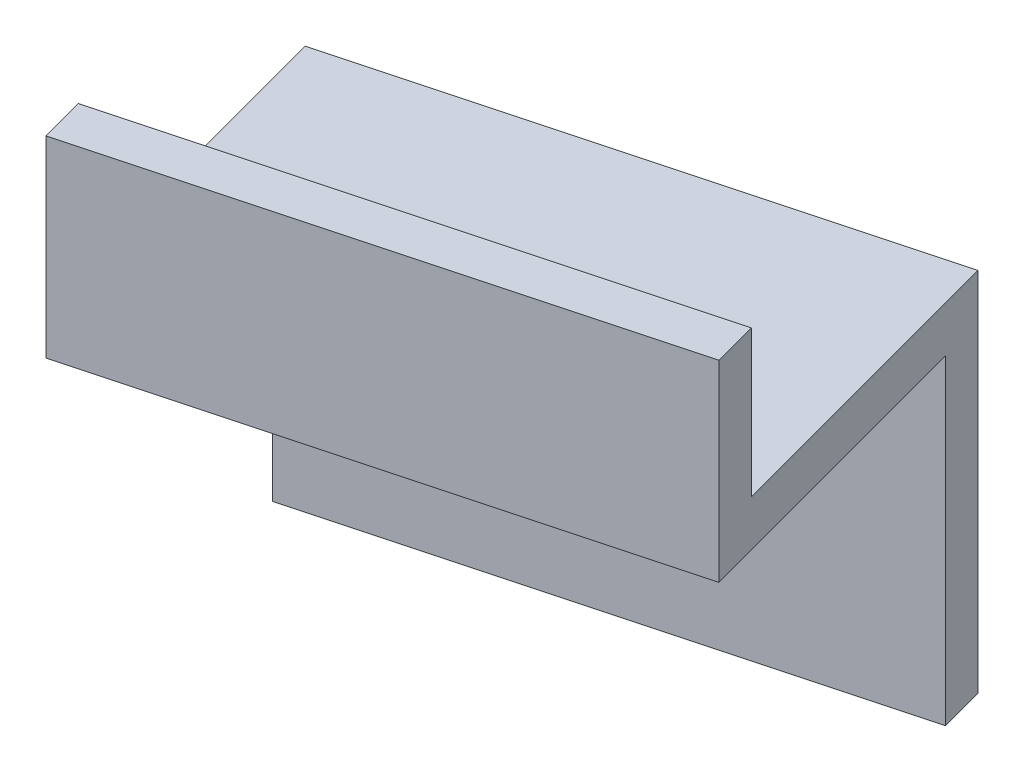
ISO-10303-21;
HEADER;
FILE_DESCRIPTION(('STEP AP214'),'2;1');
FILE_NAME('part.step','',(''),(''),'','','');
FILE_SCHEMA(('AUTOMOTIVE_DESIGN { 1 0 10303 214 1 1 1 1 }'));
ENDSEC;
DATA;
#1=APPLICATION_CONTEXT('core data for automotive mechanical design processes');
#2=APPLICATION_PROTOCOL_DEFINITION('international standard','automotive_design',2000,#1);
#3=PRODUCT_CONTEXT('',#1,'mechanical');
#4=PRODUCT('Part','Part','',(#3));
#5=PRODUCT_RELATED_PRODUCT_CATEGORY('part','',(#4));
#6=PRODUCT_DEFINITION_FORMATION('','',#4);
#7=PRODUCT_DEFINITION_CONTEXT('part definition',#1,'design');
#8=PRODUCT_DEFINITION('design','',#6,#7);
#9=PRODUCT_DEFINITION_SHAPE('','',#8);
#10=(LENGTH_UNIT() NAMED_UNIT(*) SI_UNIT(.MILLI.,.METRE.));
#11=(NAMED_UNIT(*) PLANE_ANGLE_UNIT() SI_UNIT($,.RADIAN.));
#12=(NAMED_UNIT(*) SI_UNIT($,.STERADIAN.) SOLID_ANGLE_UNIT());
#13=UNCERTAINTY_MEASURE_WITH_UNIT(LENGTH_MEASURE(1.E-05),#10,'distance_accuracy_value','');
#14=(GEOMETRIC_REPRESENTATION_CONTEXT(3) GLOBAL_UNCERTAINTY_ASSIGNED_CONTEXT((#13)) GLOBAL_UNIT_ASSIGNED_CONTEXT((#10,
#11,#12)) REPRESENTATION_CONTEXT('',''));
#15=CARTESIAN_POINT('',(0.,0.,0.));
#16=DIRECTION('',(0.,0.,1.));
#17=DIRECTION('',(1.,0.,0.));
#18=AXIS2_PLACEMENT_3D('',#15,#16,#17);
#19=CARTESIAN_POINT('',(605.17379271162,-593.,1962.810604949));
#20=DIRECTION('',(-0.258819045102985,0.,-0.965925826288944));
#21=DIRECTION('',(0.965925826288944,0.,-0.258819045102985));
#22=AXIS2_PLACEMENT_3D('',#19,#20,#21);
#23=CYLINDRICAL_SURFACE('',#22,4.5);
#24=CARTESIAN_POINT('',(605.17638090207,-593.,1962.820264207));
#25=DIRECTION('',(-0.258819045102985,0.,-0.965925826288944));
#26=DIRECTION('',(0.965925826288944,0.,-0.258819045102985));
#27=AXIS2_PLACEMENT_3D('',#24,#25,#26);
#28=CIRCLE('',#27,4.5);
#29=CARTESIAN_POINT('',(609.52304712037,-593.,1961.655578505));
#30=VERTEX_POINT('',#29);
#31=EDGE_CURVE('E153',#30,#30,#28,.T.);
#32=ORIENTED_EDGE('',*,*,#31,.T.);
#33=DIRECTION('',(0.258819045102985,0.,0.965925826288944));
#34=VECTOR('',#33,1.);
#35=CARTESIAN_POINT('',(609.52045892992,-593.,1961.645919246));
#36=LINE('',#35,#34);
#37=CARTESIAN_POINT('',(610.81714234589,-593.,1966.485207636));
#38=VERTEX_POINT('',#37);
#39=EDGE_CURVE('E11',#30,#38,#36,.T.);
#40=ORIENTED_EDGE('',*,*,#39,.T.);
#41=CARTESIAN_POINT('',(606.47047612759,-593.,1967.649893339));
#42=DIRECTION('',(-0.258819045102985,0.,-0.965925826288944));
#43=DIRECTION('',(0.965925826288944,0.,-0.258819045102985));
#44=AXIS2_PLACEMENT_3D('',#41,#42,#43);
#45=CIRCLE('',#44,4.5);
#46=EDGE_CURVE('E26',#38,#38,#45,.T.);
#47=ORIENTED_EDGE('',*,*,#46,.F.);
#48=ORIENTED_EDGE('',*,*,#39,.F.);
#49=EDGE_LOOP('',(#32,#40,#47,#48));
#50=FACE_BOUND('',#49,.T.);
#51=ADVANCED_FACE('F17',(#50),#23,.F.);
#52=CARTESIAN_POINT('',(634.15415569074,-613.,1955.055692854));
#53=DIRECTION('',(0.965925826288944,0.,-0.258819045102985));
#54=DIRECTION('',(0.,-1.,0.));
#55=AXIS2_PLACEMENT_3D('',#52,#53,#54);
#56=PLANE('',#55);
#57=DIRECTION('',(0.258819045102985,0.,0.965925826288944));
#58=VECTOR('',#57,1.);
#59=CARTESIAN_POINT('',(634.15415569074,-613.,1955.055692854));
#60=LINE('',#59,#58);
#61=CARTESIAN_POINT('',(634.15415569074,-613.,1955.055692854));
#62=VERTEX_POINT('',#61);
#63=CARTESIAN_POINT('',(635.44825091626,-613.,1959.885321986));
#64=VERTEX_POINT('',#63);
#65=EDGE_CURVE('E119',#62,#64,#60,.T.);
#66=ORIENTED_EDGE('',*,*,#65,.F.);
#67=DIRECTION('',(0.,1.,0.));
#68=VECTOR('',#67,1.);
#69=CARTESIAN_POINT('',(634.15415569074,-613.,1955.055692854));
#70=LINE('',#69,#68);
#71=CARTESIAN_POINT('',(634.15415569074,-573.,1955.055692854));
#72=VERTEX_POINT('',#71);
#73=EDGE_CURVE('E158',#62,#72,#70,.T.);
#74=ORIENTED_EDGE('',*,*,#73,.T.);
#75=DIRECTION('',(-0.258819045102985,0.,-0.965925826288944));
#76=VECTOR('',#75,1.);
#77=CARTESIAN_POINT('',(643.21282226933,-573.,1988.863096775));
#78=LINE('',#77,#76);
#79=CARTESIAN_POINT('',(643.21282226933,-573.,1988.863096775));
#80=VERTEX_POINT('',#79);
#81=EDGE_CURVE('E152',#80,#72,#78,.T.);
#82=ORIENTED_EDGE('',*,*,#81,.F.);
#83=DIRECTION('',(0.,1.,0.));
#84=VECTOR('',#83,1.);
#85=CARTESIAN_POINT('',(643.21282226933,-578.,1988.863096775));
#86=LINE('',#85,#84);
#87=CARTESIAN_POINT('',(643.21282226933,-557.,1988.863096775));
#88=VERTEX_POINT('',#87);
#89=EDGE_CURVE('E183',#80,#88,#86,.T.);
#90=ORIENTED_EDGE('',*,*,#89,.T.);
#91=DIRECTION('',(0.258819045102985,0.,0.965925826288944));
#92=VECTOR('',#91,1.);
#93=CARTESIAN_POINT('',(643.21282226933,-557.,1988.863096775));
#94=LINE('',#93,#92);
#95=CARTESIAN_POINT('',(644.50691749485,-557.,1993.692725906));
#96=VERTEX_POINT('',#95);
#97=EDGE_CURVE('E194',#88,#96,#94,.T.);
#98=ORIENTED_EDGE('',*,*,#97,.T.);
#99=DIRECTION('',(0.,-1.,0.));
#100=VECTOR('',#99,1.);
#101=CARTESIAN_POINT('',(644.50691749485,-557.,1993.692725906));
#102=LINE('',#101,#100);
#103=CARTESIAN_POINT('',(644.50691749485,-578.,1993.692725906));
#104=VERTEX_POINT('',#103);
#105=EDGE_CURVE('E202',#96,#104,#102,.T.);
#106=ORIENTED_EDGE('',*,*,#105,.T.);
#107=DIRECTION('',(-0.258819045102985,0.,-0.965925826288944));
#108=VECTOR('',#107,1.);
#109=CARTESIAN_POINT('',(644.50691749485,-578.,1993.692725906));
#110=LINE('',#109,#108);
#111=CARTESIAN_POINT('',(635.44825091626,-578.,1959.885321986));
#112=VERTEX_POINT('',#111);
#113=EDGE_CURVE('E186',#104,#112,#110,.T.);
#114=ORIENTED_EDGE('',*,*,#113,.T.);
#115=DIRECTION('',(0.,1.,0.));
#116=VECTOR('',#115,1.);
#117=CARTESIAN_POINT('',(635.44825091626,-613.,1959.885321986));
#118=LINE('',#117,#116);
#119=EDGE_CURVE('E46',#64,#112,#118,.T.);
#120=ORIENTED_EDGE('',*,*,#119,.F.);
#121=EDGE_LOOP('',(#66,#74,#82,#90,#98,#106,#114,#120));
#122=FACE_BOUND('',#121,.T.);
#123=ADVANCED_FACE('F19',(#122),#56,.T.);
#124=CARTESIAN_POINT('',(577.49270133891,-613.,1975.414464692));
#125=DIRECTION('',(0.258819045102985,0.,0.965925826288944));
#126=DIRECTION('',(0.,-1.,0.));
#127=AXIS2_PLACEMENT_3D('',#124,#125,#126);
#128=PLANE('',#127);
#129=ORIENTED_EDGE('',*,*,#46,.T.);
#130=EDGE_LOOP('',(#129));
#131=FACE_BOUND('',#130,.T.);
#132=DIRECTION('',(0.,1.,0.));
#133=VECTOR('',#132,1.);
#134=CARTESIAN_POINT('',(577.49270133891,-613.,1975.414464692));
#135=LINE('',#134,#133);
#136=CARTESIAN_POINT('',(577.49270133891,-613.,1975.414464692));
#137=VERTEX_POINT('',#136);
#138=CARTESIAN_POINT('',(577.49270133891,-578.,1975.414464692));
#139=VERTEX_POINT('',#138);
#140=EDGE_CURVE('E128',#137,#139,#135,.T.);
#141=ORIENTED_EDGE('',*,*,#140,.F.);
#142=DIRECTION('',(0.965925826288944,0.,-0.258819045102985));
#143=VECTOR('',#142,1.);
#144=CARTESIAN_POINT('',(577.49270133891,-613.,1975.414464692));
#145=LINE('',#144,#143);
#146=EDGE_CURVE('E112',#137,#64,#145,.T.);
#147=ORIENTED_EDGE('',*,*,#146,.T.);
#148=ORIENTED_EDGE('',*,*,#119,.T.);
#149=DIRECTION('',(0.965925826288944,0.,-0.258819045102985));
#150=VECTOR('',#149,1.);
#151=CARTESIAN_POINT('',(577.49270133891,-578.,1975.414464692));
#152=LINE('',#151,#150);
#153=EDGE_CURVE('E135',#139,#112,#152,.T.);
#154=ORIENTED_EDGE('',*,*,#153,.F.);
#155=EDGE_LOOP('',(#141,#147,#148,#154));
#156=FACE_BOUND('',#155,.T.);
#157=ADVANCED_FACE('F134',(#131,#156),#128,.T.);
#158=CARTESIAN_POINT('',(577.49270133891,-578.,1975.414464692));
#159=DIRECTION('',(0.,1.,0.));
#160=DIRECTION('',(1.,0.,0.));
#161=AXIS2_PLACEMENT_3D('',#158,#159,#160);
#162=PLANE('',#161);
#163=ORIENTED_EDGE('',*,*,#113,.F.);
#164=DIRECTION('',(0.965925826288944,0.,-0.258819045102985));
#165=VECTOR('',#164,1.);
#166=CARTESIAN_POINT('',(586.5513679175,-578.,2009.221868612));
#167=LINE('',#166,#165);
#168=CARTESIAN_POINT('',(586.5513679175,-578.,2009.221868612));
#169=VERTEX_POINT('',#168);
#170=EDGE_CURVE('E198',#169,#104,#167,.T.);
#171=ORIENTED_EDGE('',*,*,#170,.F.);
#172=DIRECTION('',(0.258819045102985,0.,0.965925826288944));
#173=VECTOR('',#172,1.);
#174=CARTESIAN_POINT('',(577.49270133891,-578.,1975.414464692));
#175=LINE('',#174,#173);
#176=EDGE_CURVE('E138',#139,#169,#175,.T.);
#177=ORIENTED_EDGE('',*,*,#176,.F.);
#178=ORIENTED_EDGE('',*,*,#153,.T.);
#179=EDGE_LOOP('',(#163,#171,#177,#178));
#180=FACE_BOUND('',#179,.T.);
#181=ADVANCED_FACE('F234',(#180),#162,.F.);
#182=CARTESIAN_POINT('',(586.5513679175,-578.,2009.221868612));
#183=DIRECTION('',(0.258819045102985,0.,0.965925826288944));
#184=DIRECTION('',(0.,-1.,0.));
#185=AXIS2_PLACEMENT_3D('',#182,#183,#184);
#186=PLANE('',#185);
#187=DIRECTION('',(0.,1.,0.));
#188=VECTOR('',#187,1.);
#189=CARTESIAN_POINT('',(586.5513679175,-578.,2009.221868612));
#190=LINE('',#189,#188);
#191=CARTESIAN_POINT('',(586.5513679175,-557.,2009.221868612));
#192=VERTEX_POINT('',#191);
#193=EDGE_CURVE('E143',#169,#192,#190,.T.);
#194=ORIENTED_EDGE('',*,*,#193,.F.);
#195=ORIENTED_EDGE('',*,*,#170,.T.);
#196=ORIENTED_EDGE('',*,*,#105,.F.);
#197=DIRECTION('',(0.965925826288944,0.,-0.258819045102985));
#198=VECTOR('',#197,1.);
#199=CARTESIAN_POINT('',(586.5513679175,-557.,2009.221868612));
#200=LINE('',#199,#198);
#201=EDGE_CURVE('E190',#192,#96,#200,.T.);
#202=ORIENTED_EDGE('',*,*,#201,.F.);
#203=EDGE_LOOP('',(#194,#195,#196,#202));
#204=FACE_BOUND('',#203,.T.);
#205=ADVANCED_FACE('F239',(#204),#186,.T.);
#206=CARTESIAN_POINT('',(585.25727269199,-557.,2004.392239481));
#207=DIRECTION('',(0.,1.,0.));
#208=DIRECTION('',(1.,0.,0.));
#209=AXIS2_PLACEMENT_3D('',#206,#207,#208);
#210=PLANE('',#209);
#211=DIRECTION('',(0.965925826288944,0.,-0.258819045102985));
#212=VECTOR('',#211,1.);
#213=CARTESIAN_POINT('',(585.25727269199,-557.,2004.392239481));
#214=LINE('',#213,#212);
#215=CARTESIAN_POINT('',(585.25727269199,-557.,2004.392239481));
#216=VERTEX_POINT('',#215);
#217=EDGE_CURVE('E175',#216,#88,#214,.T.);
#218=ORIENTED_EDGE('',*,*,#217,.F.);
#219=DIRECTION('',(0.258819045102985,0.,0.965925826288944));
#220=VECTOR('',#219,1.);
#221=CARTESIAN_POINT('',(585.25727269199,-557.,2004.392239481));
#222=LINE('',#221,#220);
#223=EDGE_CURVE('E157',#216,#192,#222,.T.);
#224=ORIENTED_EDGE('',*,*,#223,.T.);
#225=ORIENTED_EDGE('',*,*,#201,.T.);
#226=ORIENTED_EDGE('',*,*,#97,.F.);
#227=EDGE_LOOP('',(#218,#224,#225,#226));
#228=FACE_BOUND('',#227,.T.);
#229=ADVANCED_FACE('F241',(#228),#210,.T.);
#230=CARTESIAN_POINT('',(585.25727269199,-578.,2004.392239481));
#231=DIRECTION('',(0.258819045102985,0.,0.965925826288944));
#232=DIRECTION('',(0.,-1.,0.));
#233=AXIS2_PLACEMENT_3D('',#230,#231,#232);
#234=PLANE('',#233);
#235=ORIENTED_EDGE('',*,*,#217,.T.);
#236=ORIENTED_EDGE('',*,*,#89,.F.);
#237=DIRECTION('',(0.965925826288944,0.,-0.258819045102985));
#238=VECTOR('',#237,1.);
#239=CARTESIAN_POINT('',(585.25727269199,-573.,2004.392239481));
#240=LINE('',#239,#238);
#241=CARTESIAN_POINT('',(585.25727269199,-573.,2004.392239481));
#242=VERTEX_POINT('',#241);
#243=EDGE_CURVE('E148',#242,#80,#240,.T.);
#244=ORIENTED_EDGE('',*,*,#243,.F.);
#245=DIRECTION('',(0.,1.,0.));
#246=VECTOR('',#245,1.);
#247=CARTESIAN_POINT('',(585.25727269199,-578.,2004.392239481));
#248=LINE('',#247,#246);
#249=EDGE_CURVE('E169',#242,#216,#248,.T.);
#250=ORIENTED_EDGE('',*,*,#249,.T.);
#251=EDGE_LOOP('',(#235,#236,#244,#250));
#252=FACE_BOUND('',#251,.T.);
#253=ADVANCED_FACE('F243',(#252),#234,.F.);
#254=CARTESIAN_POINT('',(576.1986061134,-573.,1970.584835561));
#255=DIRECTION('',(0.,1.,0.));
#256=DIRECTION('',(1.,0.,0.));
#257=AXIS2_PLACEMENT_3D('',#254,#255,#256);
#258=PLANE('',#257);
#259=DIRECTION('',(0.965925826288944,0.,-0.258819045102985));
#260=VECTOR('',#259,1.);
#261=CARTESIAN_POINT('',(576.1986061134,-573.,1970.584835561));
#262=LINE('',#261,#260);
#263=CARTESIAN_POINT('',(576.1986061134,-573.,1970.584835561));
#264=VERTEX_POINT('',#263);
#265=EDGE_CURVE('E162',#264,#72,#262,.T.);
#266=ORIENTED_EDGE('',*,*,#265,.F.);
#267=DIRECTION('',(-0.258819045102985,0.,-0.965925826288944));
#268=VECTOR('',#267,1.);
#269=CARTESIAN_POINT('',(585.25727269199,-573.,2004.392239481));
#270=LINE('',#269,#268);
#271=EDGE_CURVE('E165',#242,#264,#270,.T.);
#272=ORIENTED_EDGE('',*,*,#271,.F.);
#273=ORIENTED_EDGE('',*,*,#243,.T.);
#274=ORIENTED_EDGE('',*,*,#81,.T.);
#275=EDGE_LOOP('',(#266,#272,#273,#274));
#276=FACE_BOUND('',#275,.T.);
#277=ADVANCED_FACE('F218',(#276),#258,.T.);
#278=CARTESIAN_POINT('',(576.1986061134,-613.,1970.584835561));
#279=DIRECTION('',(0.258819045102985,0.,0.965925826288944));
#280=DIRECTION('',(0.,-1.,0.));
#281=AXIS2_PLACEMENT_3D('',#278,#279,#280);
#282=PLANE('',#281);
#283=ORIENTED_EDGE('',*,*,#31,.F.);
#284=EDGE_LOOP('',(#283));
#285=FACE_BOUND('',#284,.T.);
#286=ORIENTED_EDGE('',*,*,#265,.T.);
#287=ORIENTED_EDGE('',*,*,#73,.F.);
#288=DIRECTION('',(0.965925826288944,0.,-0.258819045102985));
#289=VECTOR('',#288,1.);
#290=CARTESIAN_POINT('',(576.1986061134,-613.,1970.584835561));
#291=LINE('',#290,#289);
#292=CARTESIAN_POINT('',(576.1986061134,-613.,1970.584835561));
#293=VERTEX_POINT('',#292);
#294=EDGE_CURVE('E122',#293,#62,#291,.T.);
#295=ORIENTED_EDGE('',*,*,#294,.F.);
#296=DIRECTION('',(0.,1.,0.));
#297=VECTOR('',#296,1.);
#298=CARTESIAN_POINT('',(576.1986061134,-613.,1970.584835561));
#299=LINE('',#298,#297);
#300=EDGE_CURVE('E131',#293,#264,#299,.T.);
#301=ORIENTED_EDGE('',*,*,#300,.T.);
#302=EDGE_LOOP('',(#286,#287,#295,#301));
#303=FACE_BOUND('',#302,.T.);
#304=ADVANCED_FACE('F215',(#285,#303),#282,.F.);
#305=CARTESIAN_POINT('',(576.1986061134,-613.,1970.584835561));
#306=DIRECTION('',(0.,1.,0.));
#307=DIRECTION('',(1.,0.,0.));
#308=AXIS2_PLACEMENT_3D('',#305,#306,#307);
#309=PLANE('',#308);
#310=ORIENTED_EDGE('',*,*,#65,.T.);
#311=ORIENTED_EDGE('',*,*,#146,.F.);
#312=DIRECTION('',(0.258819045102985,0.,0.965925826288944));
#313=VECTOR('',#312,1.);
#314=CARTESIAN_POINT('',(576.1986061134,-613.,1970.584835561));
#315=LINE('',#314,#313);
#316=EDGE_CURVE('E116',#293,#137,#315,.T.);
#317=ORIENTED_EDGE('',*,*,#316,.F.);
#318=ORIENTED_EDGE('',*,*,#294,.T.);
#319=EDGE_LOOP('',(#310,#311,#317,#318));
#320=FACE_BOUND('',#319,.T.);
#321=ADVANCED_FACE('F114',(#320),#309,.F.);
#322=CARTESIAN_POINT('',(576.1986061134,-613.,1970.584835561));
#323=DIRECTION('',(0.965925826288944,0.,-0.258819045102985));
#324=DIRECTION('',(0.,-1.,0.));
#325=AXIS2_PLACEMENT_3D('',#322,#323,#324);
#326=PLANE('',#325);
#327=ORIENTED_EDGE('',*,*,#140,.T.);
#328=ORIENTED_EDGE('',*,*,#176,.T.);
#329=ORIENTED_EDGE('',*,*,#193,.T.);
#330=ORIENTED_EDGE('',*,*,#223,.F.);
#331=ORIENTED_EDGE('',*,*,#249,.F.);
#332=ORIENTED_EDGE('',*,*,#271,.T.);
#333=ORIENTED_EDGE('',*,*,#300,.F.);
#334=ORIENTED_EDGE('',*,*,#316,.T.);
#335=EDGE_LOOP('',(#327,#328,#329,#330,#331,#332,#333,#334));
#336=FACE_BOUND('',#335,.T.);
#337=ADVANCED_FACE('F126',(#336),#326,.F.);
#338=CLOSED_SHELL('',(#51,#123,#157,#181,#205,#229,#253,#277,#304,#321,#337));
#339=MANIFOLD_SOLID_BREP('B1',#338);
#340=ADVANCED_BREP_SHAPE_REPRESENTATION('',(#18,#339),#14);
#341=SHAPE_DEFINITION_REPRESENTATION(#9,#340);
ENDSEC;
END-ISO-10303-21;
